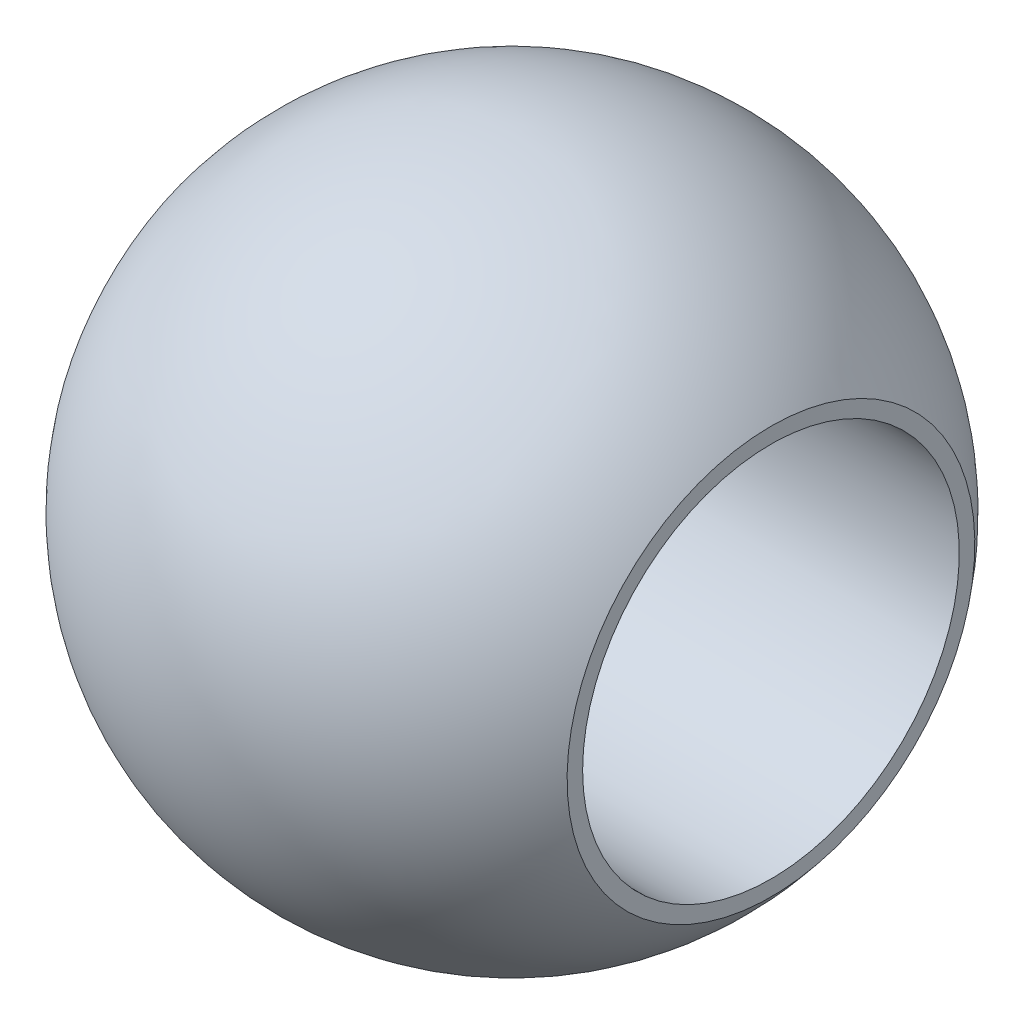
ISO-10303-21;
HEADER;
FILE_DESCRIPTION(('STEP AP214'),'2;1');
FILE_NAME('part.step','',(''),(''),'','','');
FILE_SCHEMA(('AUTOMOTIVE_DESIGN { 1 0 10303 214 1 1 1 1 }'));
ENDSEC;
DATA;
#1=APPLICATION_CONTEXT('core data for automotive mechanical design processes');
#2=APPLICATION_PROTOCOL_DEFINITION('international standard','automotive_design',2000,#1);
#3=PRODUCT_CONTEXT('',#1,'mechanical');
#4=PRODUCT('Part','Part','',(#3));
#5=PRODUCT_RELATED_PRODUCT_CATEGORY('part','',(#4));
#6=PRODUCT_DEFINITION_FORMATION('','',#4);
#7=PRODUCT_DEFINITION_CONTEXT('part definition',#1,'design');
#8=PRODUCT_DEFINITION('design','',#6,#7);
#9=PRODUCT_DEFINITION_SHAPE('','',#8);
#10=(LENGTH_UNIT() NAMED_UNIT(*) SI_UNIT(.MILLI.,.METRE.));
#11=(NAMED_UNIT(*) PLANE_ANGLE_UNIT() SI_UNIT($,.RADIAN.));
#12=(NAMED_UNIT(*) SI_UNIT($,.STERADIAN.) SOLID_ANGLE_UNIT());
#13=UNCERTAINTY_MEASURE_WITH_UNIT(LENGTH_MEASURE(1.E-05),#10,'distance_accuracy_value','');
#14=(GEOMETRIC_REPRESENTATION_CONTEXT(3) GLOBAL_UNCERTAINTY_ASSIGNED_CONTEXT((#13)) GLOBAL_UNIT_ASSIGNED_CONTEXT((#10,
#11,#12)) REPRESENTATION_CONTEXT('',''));
#15=CARTESIAN_POINT('',(0.,0.,0.));
#16=DIRECTION('',(0.,0.,1.));
#17=DIRECTION('',(1.,0.,0.));
#18=AXIS2_PLACEMENT_3D('',#15,#16,#17);
#19=CARTESIAN_POINT('',(-5.49999999999999,4.3301270189222,0.));
#20=DIRECTION('',(1.,0.,0.));
#21=DIRECTION('',(0.,0.,-1.));
#22=AXIS2_PLACEMENT_3D('',#19,#20,#21);
#23=PLANE('',#22);
#24=CARTESIAN_POINT('',(-5.5,0.,0.));
#25=DIRECTION('',(-1.,0.,0.));
#26=DIRECTION('',(0.,0.,1.));
#27=AXIS2_PLACEMENT_3D('',#24,#25,#26);
#28=CIRCLE('',#27,4.);
#29=CARTESIAN_POINT('',(-5.5,0.,4.));
#30=VERTEX_POINT('',#29);
#31=EDGE_CURVE('E10',#30,#30,#28,.T.);
#32=ORIENTED_EDGE('',*,*,#31,.F.);
#33=EDGE_LOOP('',(#32));
#34=FACE_BOUND('',#33,.T.);
#35=CARTESIAN_POINT('',(-5.49999999999999,0.,0.));
#36=DIRECTION('',(-1.,0.,0.));
#37=DIRECTION('',(0.,0.,1.));
#38=AXIS2_PLACEMENT_3D('',#35,#36,#37);
#39=CIRCLE('',#38,4.3301270189222);
#40=CARTESIAN_POINT('',(-5.49999999999999,4.33012701892221,0.));
#41=VERTEX_POINT('',#40);
#42=EDGE_CURVE('E45',#41,#41,#39,.T.);
#43=ORIENTED_EDGE('',*,*,#42,.T.);
#44=EDGE_LOOP('',(#43));
#45=FACE_BOUND('',#44,.T.);
#46=ADVANCED_FACE('F31',(#34,#45),#23,.F.);
#47=CARTESIAN_POINT('',(-26.541580869231,0.,0.));
#48=DIRECTION('',(-1.,0.,0.));
#49=DIRECTION('',(0.,0.,1.));
#50=AXIS2_PLACEMENT_3D('',#47,#48,#49);
#51=CYLINDRICAL_SURFACE('',#50,4.);
#52=CARTESIAN_POINT('',(5.5,0.,0.));
#53=DIRECTION('',(-1.,0.,0.));
#54=DIRECTION('',(0.,0.,1.));
#55=AXIS2_PLACEMENT_3D('',#52,#53,#54);
#56=CIRCLE('',#55,4.);
#57=CARTESIAN_POINT('',(5.5,0.,4.));
#58=VERTEX_POINT('',#57);
#59=EDGE_CURVE('E37',#58,#58,#56,.T.);
#60=ORIENTED_EDGE('',*,*,#59,.F.);
#61=EDGE_LOOP('',(#60));
#62=FACE_BOUND('',#61,.T.);
#63=ORIENTED_EDGE('',*,*,#31,.T.);
#64=EDGE_LOOP('',(#63));
#65=FACE_BOUND('',#64,.T.);
#66=ADVANCED_FACE('F60',(#62,#65),#51,.F.);
#67=CARTESIAN_POINT('',(5.5,4.3301270189222,0.));
#68=DIRECTION('',(-1.,0.,0.));
#69=DIRECTION('',(0.,0.,1.));
#70=AXIS2_PLACEMENT_3D('',#67,#68,#69);
#71=PLANE('',#70);
#72=CARTESIAN_POINT('',(5.5,0.,0.));
#73=DIRECTION('',(-1.,0.,0.));
#74=DIRECTION('',(0.,0.,1.));
#75=AXIS2_PLACEMENT_3D('',#72,#73,#74);
#76=CIRCLE('',#75,4.3301270189222);
#77=CARTESIAN_POINT('',(5.5,4.3301270189222,0.));
#78=VERTEX_POINT('',#77);
#79=EDGE_CURVE('E41',#78,#78,#76,.T.);
#80=ORIENTED_EDGE('',*,*,#79,.F.);
#81=EDGE_LOOP('',(#80));
#82=FACE_BOUND('',#81,.T.);
#83=ORIENTED_EDGE('',*,*,#59,.T.);
#84=EDGE_LOOP('',(#83));
#85=FACE_BOUND('',#84,.T.);
#86=ADVANCED_FACE('F55',(#82,#85),#71,.F.);
#87=CARTESIAN_POINT('',(0.,0.,0.));
#88=DIRECTION('',(-1.,0.,0.));
#89=DIRECTION('',(0.,1.,0.));
#90=AXIS2_PLACEMENT_3D('',#87,#88,#89);
#91=SPHERICAL_SURFACE('',#90,7.);
#92=CARTESIAN_POINT('',(-5.49999999999999,4.33012701892221,0.));
#93=CARTESIAN_POINT('',(-5.41846601034655,4.4336959812425,0.));
#94=CARTESIAN_POINT('',(-5.33400044553384,4.53495639564665,0.));
#95=CARTESIAN_POINT('',(-5.15948967879926,4.7325494721974,0.));
#96=CARTESIAN_POINT('',(-5.06944447687739,4.82888213434402,0.));
#97=CARTESIAN_POINT('',(-4.88405794913384,5.01630904995447,0.));
#98=CARTESIAN_POINT('',(-4.78871662331217,5.10740330341832,0.));
#99=CARTESIAN_POINT('',(-4.59304302717547,5.28406367004035,0.));
#100=CARTESIAN_POINT('',(-4.49271075686045,5.36962978319854,0.));
#101=CARTESIAN_POINT('',(-4.28737509591277,5.53496064551229,0.));
#102=CARTESIAN_POINT('',(-4.18237170528012,5.61472539466786,0.));
#103=CARTESIAN_POINT('',(-3.96802887279707,5.76819911605781,0.));
#104=CARTESIAN_POINT('',(-3.85868943094667,5.8419080882922,0.));
#105=CARTESIAN_POINT('',(-3.63602330685459,5.98303508188158,0.));
#106=CARTESIAN_POINT('',(-3.52269662461291,6.05045310323656,0.));
#107=CARTESIAN_POINT('',(-3.29241757581232,6.17878311310837,0.));
#108=CARTESIAN_POINT('',(-3.17546520925342,6.23969510162519,0.));
#109=CARTESIAN_POINT('',(-2.93830790847749,6.3548187145136,0.));
#110=CARTESIAN_POINT('',(-2.81810297426047,6.4090303388852,0.));
#111=CARTESIAN_POINT('',(-2.574824033396,6.5105802701885,0.));
#112=CARTESIAN_POINT('',(-2.45175002674855,6.55791857712021,0.));
#113=CARTESIAN_POINT('',(-2.2031255891003,6.64557084806493,0.));
#114=CARTESIAN_POINT('',(-2.0775751580995,6.68588481207794,0.));
#115=CARTESIAN_POINT('',(-1.82439842058906,6.75935978187485,0.));
#116=CARTESIAN_POINT('',(-1.69677211407942,6.79252078765875,0.));
#117=CARTESIAN_POINT('',(-1.43985079711479,6.85158404604037,0.));
#118=CARTESIAN_POINT('',(-1.31055578665979,6.8774862986381,0.));
#119=CARTESIAN_POINT('',(-1.05070955711334,6.92194941360377,0.));
#120=CARTESIAN_POINT('',(-0.920158338021881,6.94051027597171,0.));
#121=CARTESIAN_POINT('',(-0.658216194244204,6.9702313949779,0.));
#122=CARTESIAN_POINT('',(-0.526825269557983,6.98139165161616,0.));
#123=CARTESIAN_POINT('',(-0.263622896581174,6.99627595412721,0.));
#124=CARTESIAN_POINT('',(-0.131811448290585,7.,0.));
#125=CARTESIAN_POINT('',(0.131811448290593,7.,0.));
#126=CARTESIAN_POINT('',(0.263622896581181,6.99627595412721,0.));
#127=CARTESIAN_POINT('',(0.526825269557991,6.98139165161616,0.));
#128=CARTESIAN_POINT('',(0.658216194244213,6.9702313949779,0.));
#129=CARTESIAN_POINT('',(0.920158338021889,6.94051027597171,0.));
#130=CARTESIAN_POINT('',(1.05070955711334,6.92194941360376,0.));
#131=CARTESIAN_POINT('',(1.3105557866598,6.8774862986381,0.));
#132=CARTESIAN_POINT('',(1.4398507971148,6.85158404604037,0.));
#133=CARTESIAN_POINT('',(1.69677211407943,6.79252078765875,0.));
#134=CARTESIAN_POINT('',(1.82439842058906,6.75935978187484,0.));
#135=CARTESIAN_POINT('',(2.0775751580995,6.68588481207794,0.));
#136=CARTESIAN_POINT('',(2.20312558910031,6.64557084806493,0.));
#137=CARTESIAN_POINT('',(2.45175002674856,6.55791857712021,0.));
#138=CARTESIAN_POINT('',(2.57482403339601,6.5105802701885,0.));
#139=CARTESIAN_POINT('',(2.81810297426048,6.40903033888519,0.));
#140=CARTESIAN_POINT('',(2.9383079084775,6.3548187145136,0.));
#141=CARTESIAN_POINT('',(3.17546520925342,6.23969510162519,0.));
#142=CARTESIAN_POINT('',(3.29241757581233,6.17878311310837,0.));
#143=CARTESIAN_POINT('',(3.52269662461291,6.05045310323656,0.));
#144=CARTESIAN_POINT('',(3.6360233068546,5.98303508188157,0.));
#145=CARTESIAN_POINT('',(3.85868943094668,5.8419080882922,0.));
#146=CARTESIAN_POINT('',(3.96802887279708,5.76819911605781,0.));
#147=CARTESIAN_POINT('',(4.18237170528012,5.61472539466785,0.));
#148=CARTESIAN_POINT('',(4.28737509591278,5.53496064551228,0.));
#149=CARTESIAN_POINT('',(4.49271075686045,5.36962978319853,0.));
#150=CARTESIAN_POINT('',(4.59304302717548,5.28406367004034,0.));
#151=CARTESIAN_POINT('',(4.78871662331217,5.10740330341831,0.));
#152=CARTESIAN_POINT('',(4.88405794913385,5.01630904995447,0.));
#153=CARTESIAN_POINT('',(5.0694444768774,4.82888213434401,0.));
#154=CARTESIAN_POINT('',(5.15948967879926,4.7325494721974,0.));
#155=CARTESIAN_POINT('',(5.33400044553384,4.53495639564664,0.));
#156=CARTESIAN_POINT('',(5.41846601034655,4.4336959812425,0.));
#157=CARTESIAN_POINT('',(5.5,4.3301270189222,0.));
#158=B_SPLINE_CURVE_WITH_KNOTS('',3,(#92,#93,#94,#95,#96,#97,#98,#99,#100,#101,#102,#103,#104,
#105,#106,#107,#108,#109,#110,#111,#112,#113,#114,#115,#116,#117,#118,#119,#120,#121,#122,#123,
#124,#125,#126,#127,#128,#129,#130,#131,#132,#133,#134,#135,#136,#137,#138,#139,#140,#141,#142,
#143,#144,#145,#146,#147,#148,#149,#150,#151,#152,#153,#154,#155,#156,#157),.UNSPECIFIED.,.F.,
.F.,(4,2,2,2,2,2,2,2,2,2,2,2,2,2,2,2,2,2,2,2,2,2,2,2,2,2,2,2,2,2,2,2,4),(0.,0.395381789915141,
0.790763579830282,1.18614536974542,1.58152715966056,1.97690894957571,2.37229073949085,
2.76767252940599,3.16305431932113,3.55843610923627,3.95381789915141,4.34919968906655,
4.74458147898169,5.13996326889684,5.53534505881198,5.93072684872712,6.32610863864226,
6.7214904285574,7.11687221847254,7.51225400838768,7.90763579830282,8.30301758821797,
8.69839937813311,9.09378116804825,9.48916295796339,9.88454474787853,10.2799265377937,
10.6753083277088,11.070690117624,11.4660719075391,11.8614536974542,12.2568354873694,
12.6522172772845),.UNSPECIFIED.);
#159=EDGE_CURVE('BSEAM52',#41,#78,#158,.T.);
#160=ORIENTED_EDGE('',*,*,#42,.F.);
#161=ORIENTED_EDGE('',*,*,#79,.T.);
#162=ORIENTED_EDGE('',*,*,#159,.T.);
#163=ORIENTED_EDGE('',*,*,#159,.F.);
#164=EDGE_LOOP('',(#160,#162,#161,#163));
#165=FACE_BOUND('',#164,.T.);
#166=ADVANCED_FACE('F52',(#165),#91,.T.);
#167=CLOSED_SHELL('',(#46,#66,#86,#166));
#168=MANIFOLD_SOLID_BREP('B2',#167);
#169=ADVANCED_BREP_SHAPE_REPRESENTATION('',(#18,#168),#14);
#170=SHAPE_DEFINITION_REPRESENTATION(#9,#169);
ENDSEC;
END-ISO-10303-21;
